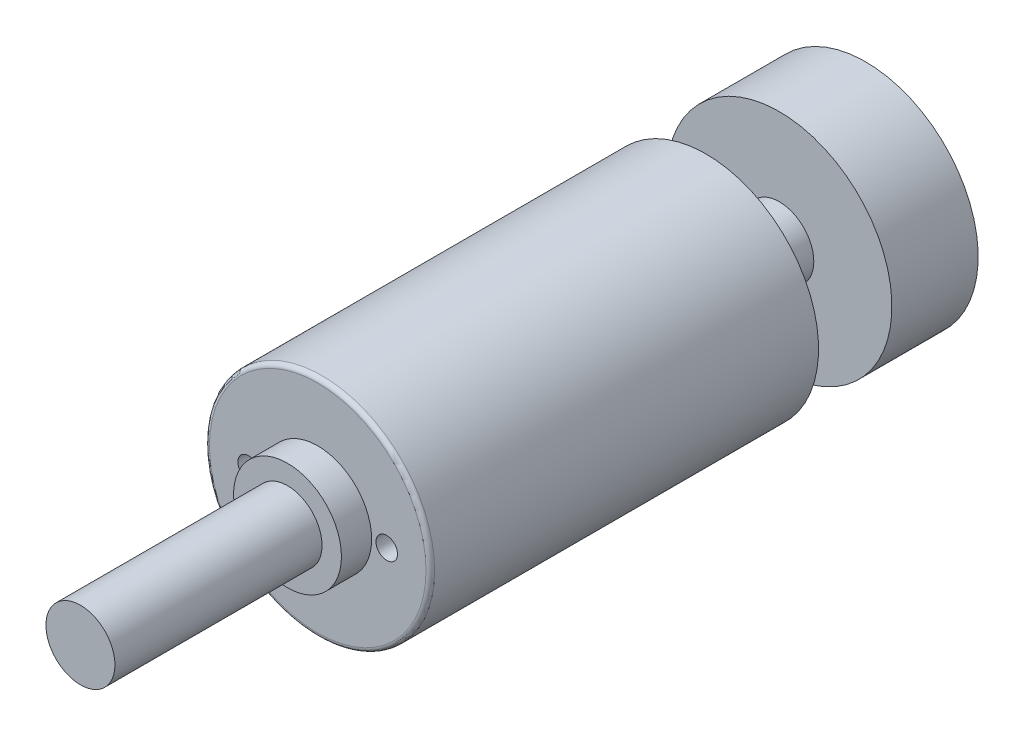
ISO-10303-21;
HEADER;
FILE_DESCRIPTION(('STEP AP214'),'2;1');
FILE_NAME('part.step','',(''),(''),'','','');
FILE_SCHEMA(('AUTOMOTIVE_DESIGN { 1 0 10303 214 1 1 1 1 }'));
ENDSEC;
DATA;
#1=APPLICATION_CONTEXT('core data for automotive mechanical design processes');
#2=APPLICATION_PROTOCOL_DEFINITION('international standard','automotive_design',2000,#1);
#3=PRODUCT_CONTEXT('',#1,'mechanical');
#4=PRODUCT('Part','Part','',(#3));
#5=PRODUCT_RELATED_PRODUCT_CATEGORY('part','',(#4));
#6=PRODUCT_DEFINITION_FORMATION('','',#4);
#7=PRODUCT_DEFINITION_CONTEXT('part definition',#1,'design');
#8=PRODUCT_DEFINITION('design','',#6,#7);
#9=PRODUCT_DEFINITION_SHAPE('','',#8);
#10=(LENGTH_UNIT() NAMED_UNIT(*) SI_UNIT(.MILLI.,.METRE.));
#11=(NAMED_UNIT(*) PLANE_ANGLE_UNIT() SI_UNIT($,.RADIAN.));
#12=(NAMED_UNIT(*) SI_UNIT($,.STERADIAN.) SOLID_ANGLE_UNIT());
#13=UNCERTAINTY_MEASURE_WITH_UNIT(LENGTH_MEASURE(1.E-05),#10,'distance_accuracy_value','');
#14=(GEOMETRIC_REPRESENTATION_CONTEXT(3) GLOBAL_UNCERTAINTY_ASSIGNED_CONTEXT((#13)) GLOBAL_UNIT_ASSIGNED_CONTEXT((#10,
#11,#12)) REPRESENTATION_CONTEXT('',''));
#15=CARTESIAN_POINT('',(0.,0.,0.));
#16=DIRECTION('',(0.,0.,1.));
#17=DIRECTION('',(1.,0.,0.));
#18=AXIS2_PLACEMENT_3D('',#15,#16,#17);
#19=CARTESIAN_POINT('',(0.,0.,0.));
#20=DIRECTION('',(0.,0.,1.));
#21=DIRECTION('',(1.,0.,0.));
#22=AXIS2_PLACEMENT_3D('',#19,#20,#21);
#23=PLANE('',#22);
#24=CARTESIAN_POINT('',(0.,0.,0.));
#25=DIRECTION('',(0.,0.,1.));
#26=DIRECTION('',(1.,0.,0.));
#27=AXIS2_PLACEMENT_3D('',#24,#25,#26);
#28=CIRCLE('',#27,26.1);
#29=CARTESIAN_POINT('',(-26.1,0.,0.));
#30=VERTEX_POINT('',#29);
#31=EDGE_CURVE('E46',#30,#30,#28,.T.);
#32=ORIENTED_EDGE('',*,*,#31,.F.);
#33=EDGE_LOOP('',(#32));
#34=FACE_BOUND('',#33,.T.);
#35=CARTESIAN_POINT('',(0.,0.,0.));
#36=DIRECTION('',(0.,0.,1.));
#37=DIRECTION('',(1.,0.,0.));
#38=AXIS2_PLACEMENT_3D('',#35,#36,#37);
#39=CIRCLE('',#38,8.);
#40=CARTESIAN_POINT('',(8.,0.,0.));
#41=VERTEX_POINT('',#40);
#42=EDGE_CURVE('E10',#41,#41,#39,.F.);
#43=ORIENTED_EDGE('',*,*,#42,.F.);
#44=EDGE_LOOP('',(#43));
#45=FACE_BOUND('',#44,.T.);
#46=ADVANCED_FACE('F31',(#34,#45),#23,.F.);
#47=CARTESIAN_POINT('',(0.,0.,97.));
#48=DIRECTION('',(0.,0.,1.));
#49=DIRECTION('',(1.,0.,0.));
#50=AXIS2_PLACEMENT_3D('',#47,#48,#49);
#51=PLANE('',#50);
#52=CARTESIAN_POINT('',(0.,0.,97.));
#53=DIRECTION('',(0.,0.,1.));
#54=DIRECTION('',(1.,0.,0.));
#55=AXIS2_PLACEMENT_3D('',#52,#53,#54);
#56=CIRCLE('',#55,12.5);
#57=CARTESIAN_POINT('',(12.5,0.,97.));
#58=VERTEX_POINT('',#57);
#59=EDGE_CURVE('E51',#58,#58,#56,.T.);
#60=ORIENTED_EDGE('',*,*,#59,.T.);
#61=EDGE_LOOP('',(#60));
#62=FACE_BOUND('',#61,.T.);
#63=CARTESIAN_POINT('',(0.,0.,97.));
#64=DIRECTION('',(0.,0.,1.));
#65=DIRECTION('',(1.,0.,0.));
#66=AXIS2_PLACEMENT_3D('',#63,#64,#65);
#67=CIRCLE('',#66,8.);
#68=CARTESIAN_POINT('',(8.,0.,97.));
#69=VERTEX_POINT('',#68);
#70=EDGE_CURVE('E58',#69,#69,#67,.T.);
#71=ORIENTED_EDGE('',*,*,#70,.F.);
#72=EDGE_LOOP('',(#71));
#73=FACE_BOUND('',#72,.T.);
#74=ADVANCED_FACE('F110',(#62,#73),#51,.T.);
#75=CARTESIAN_POINT('',(0.,0.,90.));
#76=DIRECTION('',(0.,0.,1.));
#77=DIRECTION('',(1.,0.,0.));
#78=AXIS2_PLACEMENT_3D('',#75,#76,#77);
#79=PLANE('',#78);
#80=CARTESIAN_POINT('',(16.,0.,90.));
#81=DIRECTION('',(0.,0.,1.));
#82=DIRECTION('',(1.,0.,0.));
#83=AXIS2_PLACEMENT_3D('',#80,#81,#82);
#84=CIRCLE('',#83,2.5);
#85=CARTESIAN_POINT('',(18.5,0.,90.));
#86=VERTEX_POINT('',#85);
#87=EDGE_CURVE('E70',#86,#86,#84,.T.);
#88=ORIENTED_EDGE('',*,*,#87,.F.);
#89=EDGE_LOOP('',(#88));
#90=FACE_BOUND('',#89,.T.);
#91=CARTESIAN_POINT('',(-16.,0.,90.));
#92=DIRECTION('',(0.,0.,1.));
#93=DIRECTION('',(1.,0.,0.));
#94=AXIS2_PLACEMENT_3D('',#91,#92,#93);
#95=CIRCLE('',#94,2.5);
#96=CARTESIAN_POINT('',(-13.5,0.,90.));
#97=VERTEX_POINT('',#96);
#98=EDGE_CURVE('E64',#97,#97,#95,.T.);
#99=ORIENTED_EDGE('',*,*,#98,.F.);
#100=EDGE_LOOP('',(#99));
#101=FACE_BOUND('',#100,.T.);
#102=CARTESIAN_POINT('',(0.,0.,90.));
#103=DIRECTION('',(0.,0.,1.));
#104=DIRECTION('',(1.,0.,0.));
#105=AXIS2_PLACEMENT_3D('',#102,#103,#104);
#106=CIRCLE('',#105,25.1);
#107=CARTESIAN_POINT('',(25.1,0.,90.));
#108=VERTEX_POINT('',#107);
#109=EDGE_CURVE('E42',#108,#108,#106,.T.);
#110=ORIENTED_EDGE('',*,*,#109,.T.);
#111=EDGE_LOOP('',(#110));
#112=FACE_BOUND('',#111,.T.);
#113=CARTESIAN_POINT('',(0.,0.,90.));
#114=DIRECTION('',(0.,0.,1.));
#115=DIRECTION('',(1.,0.,0.));
#116=AXIS2_PLACEMENT_3D('',#113,#114,#115);
#117=CIRCLE('',#116,12.5);
#118=CARTESIAN_POINT('',(12.5,0.,90.));
#119=VERTEX_POINT('',#118);
#120=EDGE_CURVE('E52',#119,#119,#117,.T.);
#121=ORIENTED_EDGE('',*,*,#120,.F.);
#122=EDGE_LOOP('',(#121));
#123=FACE_BOUND('',#122,.T.);
#124=ADVANCED_FACE('F116',(#90,#101,#112,#123),#79,.T.);
#125=CARTESIAN_POINT('',(0.,0.,90.));
#126=DIRECTION('',(0.,0.,-1.));
#127=DIRECTION('',(-1.,0.,0.));
#128=AXIS2_PLACEMENT_3D('',#125,#126,#127);
#129=CYLINDRICAL_SURFACE('',#128,26.1);
#130=CARTESIAN_POINT('',(0.,0.,89.));
#131=DIRECTION('',(0.,0.,1.));
#132=DIRECTION('',(1.,0.,0.));
#133=AXIS2_PLACEMENT_3D('',#130,#131,#132);
#134=CIRCLE('',#133,26.1);
#135=CARTESIAN_POINT('',(-26.1,0.,89.));
#136=VERTEX_POINT('',#135);
#137=EDGE_CURVE('E38',#136,#136,#134,.F.);
#138=CARTESIAN_POINT('',(-26.1,0.,89.));
#139=CARTESIAN_POINT('',(-26.1,0.,88.0729166666667));
#140=CARTESIAN_POINT('',(-26.1,0.,87.1458333333333));
#141=CARTESIAN_POINT('',(-26.1,0.,85.2916666666667));
#142=CARTESIAN_POINT('',(-26.1,0.,84.3645833333333));
#143=CARTESIAN_POINT('',(-26.1,0.,82.5104166666667));
#144=CARTESIAN_POINT('',(-26.1,0.,81.5833333333333));
#145=CARTESIAN_POINT('',(-26.1,0.,79.7291666666667));
#146=CARTESIAN_POINT('',(-26.1,0.,78.8020833333333));
#147=CARTESIAN_POINT('',(-26.1,0.,76.9479166666667));
#148=CARTESIAN_POINT('',(-26.1,0.,76.0208333333333));
#149=CARTESIAN_POINT('',(-26.1,0.,74.1666666666667));
#150=CARTESIAN_POINT('',(-26.1,0.,73.2395833333333));
#151=CARTESIAN_POINT('',(-26.1,0.,71.3854166666667));
#152=CARTESIAN_POINT('',(-26.1,0.,70.4583333333333));
#153=CARTESIAN_POINT('',(-26.1,0.,68.6041666666667));
#154=CARTESIAN_POINT('',(-26.1,0.,67.6770833333333));
#155=CARTESIAN_POINT('',(-26.1,0.,65.8229166666667));
#156=CARTESIAN_POINT('',(-26.1,0.,64.8958333333333));
#157=CARTESIAN_POINT('',(-26.1,0.,63.0416666666667));
#158=CARTESIAN_POINT('',(-26.1,0.,62.1145833333333));
#159=CARTESIAN_POINT('',(-26.1,0.,60.2604166666667));
#160=CARTESIAN_POINT('',(-26.1,0.,59.3333333333333));
#161=CARTESIAN_POINT('',(-26.1,0.,57.4791666666667));
#162=CARTESIAN_POINT('',(-26.1,0.,56.5520833333333));
#163=CARTESIAN_POINT('',(-26.1,0.,54.6979166666667));
#164=CARTESIAN_POINT('',(-26.1,0.,53.7708333333333));
#165=CARTESIAN_POINT('',(-26.1,0.,51.9166666666667));
#166=CARTESIAN_POINT('',(-26.1,0.,50.9895833333333));
#167=CARTESIAN_POINT('',(-26.1,0.,49.1354166666667));
#168=CARTESIAN_POINT('',(-26.1,0.,48.2083333333333));
#169=CARTESIAN_POINT('',(-26.1,0.,46.3541666666667));
#170=CARTESIAN_POINT('',(-26.1,0.,45.4270833333333));
#171=CARTESIAN_POINT('',(-26.1,0.,43.5729166666667));
#172=CARTESIAN_POINT('',(-26.1,0.,42.6458333333333));
#173=CARTESIAN_POINT('',(-26.1,0.,40.7916666666667));
#174=CARTESIAN_POINT('',(-26.1,0.,39.8645833333333));
#175=CARTESIAN_POINT('',(-26.1,0.,38.0104166666667));
#176=CARTESIAN_POINT('',(-26.1,0.,37.0833333333333));
#177=CARTESIAN_POINT('',(-26.1,0.,35.2291666666667));
#178=CARTESIAN_POINT('',(-26.1,0.,34.3020833333333));
#179=CARTESIAN_POINT('',(-26.1,0.,32.4479166666667));
#180=CARTESIAN_POINT('',(-26.1,0.,31.5208333333333));
#181=CARTESIAN_POINT('',(-26.1,0.,29.6666666666667));
#182=CARTESIAN_POINT('',(-26.1,0.,28.7395833333333));
#183=CARTESIAN_POINT('',(-26.1,0.,26.8854166666667));
#184=CARTESIAN_POINT('',(-26.1,0.,25.9583333333333));
#185=CARTESIAN_POINT('',(-26.1,0.,24.1041666666667));
#186=CARTESIAN_POINT('',(-26.1,0.,23.1770833333333));
#187=CARTESIAN_POINT('',(-26.1,0.,21.3229166666667));
#188=CARTESIAN_POINT('',(-26.1,0.,20.3958333333333));
#189=CARTESIAN_POINT('',(-26.1,0.,18.5416666666667));
#190=CARTESIAN_POINT('',(-26.1,0.,17.6145833333333));
#191=CARTESIAN_POINT('',(-26.1,0.,15.7604166666667));
#192=CARTESIAN_POINT('',(-26.1,0.,14.8333333333333));
#193=CARTESIAN_POINT('',(-26.1,0.,12.9791666666666));
#194=CARTESIAN_POINT('',(-26.1,0.,12.0520833333333));
#195=CARTESIAN_POINT('',(-26.1,0.,10.1979166666666));
#196=CARTESIAN_POINT('',(-26.1,0.,9.27083333333332));
#197=CARTESIAN_POINT('',(-26.1,0.,7.41666666666665));
#198=CARTESIAN_POINT('',(-26.1,0.,6.48958333333332));
#199=CARTESIAN_POINT('',(-26.1,0.,4.63541666666665));
#200=CARTESIAN_POINT('',(-26.1,0.,3.70833333333332));
#201=CARTESIAN_POINT('',(-26.1,0.,1.85416666666665));
#202=CARTESIAN_POINT('',(-26.1,0.,0.92708333333332));
#203=CARTESIAN_POINT('',(-26.1,0.,0.));
#204=B_SPLINE_CURVE_WITH_KNOTS('',3,(#138,#139,#140,#141,#142,#143,#144,#145,#146,#147,#148,
#149,#150,#151,#152,#153,#154,#155,#156,#157,#158,#159,#160,#161,#162,#163,#164,#165,#166,#167,
#168,#169,#170,#171,#172,#173,#174,#175,#176,#177,#178,#179,#180,#181,#182,#183,#184,#185,#186,
#187,#188,#189,#190,#191,#192,#193,#194,#195,#196,#197,#198,#199,#200,#201,#202,#203),
.UNSPECIFIED.,.F.,.F.,(4,2,2,2,2,2,2,2,2,2,2,2,2,2,2,2,2,2,2,2,2,2,2,2,2,2,2,2,2,2,2,2,4),(0.,
2.78125,5.5625,8.34375,11.125,13.90625,16.6875,19.46875,22.25,25.03125,27.8125,30.59375,33.375,
36.15625,38.9375,41.71875,44.5,47.28125,50.0625,52.84375,55.625,58.40625,61.1875,63.96875,66.75,
69.53125,72.3125,75.09375,77.875,80.65625,83.4375,86.21875,89.),.UNSPECIFIED.);
#205=EDGE_CURVE('BSEAM123',#136,#30,#204,.T.);
#206=ORIENTED_EDGE('',*,*,#137,.T.);
#207=ORIENTED_EDGE('',*,*,#31,.T.);
#208=ORIENTED_EDGE('',*,*,#205,.T.);
#209=ORIENTED_EDGE('',*,*,#205,.F.);
#210=EDGE_LOOP('',(#206,#208,#207,#209));
#211=FACE_BOUND('',#210,.T.);
#212=ADVANCED_FACE('F123',(#211),#129,.T.);
#213=CARTESIAN_POINT('',(0.,0.,89.));
#214=DIRECTION('',(0.,0.,1.));
#215=DIRECTION('',(1.,0.,0.));
#216=AXIS2_PLACEMENT_3D('',#213,#214,#215);
#217=TOROIDAL_SURFACE('',#216,25.1,1.);
#218=ORIENTED_EDGE('',*,*,#137,.F.);
#219=EDGE_LOOP('',(#218));
#220=FACE_BOUND('',#219,.T.);
#221=ORIENTED_EDGE('',*,*,#109,.F.);
#222=EDGE_LOOP('',(#221));
#223=FACE_BOUND('',#222,.T.);
#224=ADVANCED_FACE('F33',(#220,#223),#217,.T.);
#225=CARTESIAN_POINT('',(0.,0.,97.));
#226=DIRECTION('',(0.,0.,-1.));
#227=DIRECTION('',(-1.,0.,0.));
#228=AXIS2_PLACEMENT_3D('',#225,#226,#227);
#229=CYLINDRICAL_SURFACE('',#228,12.5);
#230=ORIENTED_EDGE('',*,*,#59,.F.);
#231=EDGE_LOOP('',(#230));
#232=FACE_BOUND('',#231,.T.);
#233=ORIENTED_EDGE('',*,*,#120,.T.);
#234=EDGE_LOOP('',(#233));
#235=FACE_BOUND('',#234,.T.);
#236=ADVANCED_FACE('F129',(#232,#235),#229,.T.);
#237=CARTESIAN_POINT('',(0.,0.,145.));
#238=DIRECTION('',(0.,0.,-1.));
#239=DIRECTION('',(-1.,0.,0.));
#240=AXIS2_PLACEMENT_3D('',#237,#238,#239);
#241=CYLINDRICAL_SURFACE('',#240,8.);
#242=CARTESIAN_POINT('',(0.,0.,145.));
#243=DIRECTION('',(0.,0.,1.));
#244=DIRECTION('',(1.,0.,0.));
#245=AXIS2_PLACEMENT_3D('',#242,#243,#244);
#246=CIRCLE('',#245,8.);
#247=CARTESIAN_POINT('',(8.,0.,145.));
#248=VERTEX_POINT('',#247);
#249=EDGE_CURVE('E55',#248,#248,#246,.T.);
#250=ORIENTED_EDGE('',*,*,#249,.F.);
#251=EDGE_LOOP('',(#250));
#252=FACE_BOUND('',#251,.T.);
#253=ORIENTED_EDGE('',*,*,#70,.T.);
#254=EDGE_LOOP('',(#253));
#255=FACE_BOUND('',#254,.T.);
#256=ADVANCED_FACE('F144',(#252,#255),#241,.T.);
#257=CARTESIAN_POINT('',(0.,0.,145.));
#258=DIRECTION('',(0.,0.,1.));
#259=DIRECTION('',(1.,0.,0.));
#260=AXIS2_PLACEMENT_3D('',#257,#258,#259);
#261=PLANE('',#260);
#262=ORIENTED_EDGE('',*,*,#249,.T.);
#263=EDGE_LOOP('',(#262));
#264=FACE_BOUND('',#263,.T.);
#265=ADVANCED_FACE('F149',(#264),#261,.T.);
#266=CARTESIAN_POINT('',(-16.,0.,85.));
#267=DIRECTION('',(0.,0.,1.));
#268=DIRECTION('',(1.,0.,0.));
#269=AXIS2_PLACEMENT_3D('',#266,#267,#268);
#270=CYLINDRICAL_SURFACE('',#269,2.5);
#271=CARTESIAN_POINT('',(-16.,0.,85.));
#272=DIRECTION('',(0.,0.,1.));
#273=DIRECTION('',(1.,0.,0.));
#274=AXIS2_PLACEMENT_3D('',#271,#272,#273);
#275=CIRCLE('',#274,2.5);
#276=CARTESIAN_POINT('',(-13.5,0.,85.));
#277=VERTEX_POINT('',#276);
#278=EDGE_CURVE('E61',#277,#277,#275,.T.);
#279=ORIENTED_EDGE('',*,*,#278,.F.);
#280=EDGE_LOOP('',(#279));
#281=FACE_BOUND('',#280,.T.);
#282=ORIENTED_EDGE('',*,*,#98,.T.);
#283=EDGE_LOOP('',(#282));
#284=FACE_BOUND('',#283,.T.);
#285=ADVANCED_FACE('F156',(#281,#284),#270,.F.);
#286=CARTESIAN_POINT('',(-16.,0.,85.));
#287=DIRECTION('',(0.,0.,1.));
#288=DIRECTION('',(1.,0.,0.));
#289=AXIS2_PLACEMENT_3D('',#286,#287,#288);
#290=PLANE('',#289);
#291=ORIENTED_EDGE('',*,*,#278,.T.);
#292=EDGE_LOOP('',(#291));
#293=FACE_BOUND('',#292,.T.);
#294=ADVANCED_FACE('F160',(#293),#290,.T.);
#295=CARTESIAN_POINT('',(16.,0.,85.));
#296=DIRECTION('',(0.,0.,1.));
#297=DIRECTION('',(1.,0.,0.));
#298=AXIS2_PLACEMENT_3D('',#295,#296,#297);
#299=CYLINDRICAL_SURFACE('',#298,2.5);
#300=CARTESIAN_POINT('',(16.,0.,85.));
#301=DIRECTION('',(0.,0.,1.));
#302=DIRECTION('',(1.,0.,0.));
#303=AXIS2_PLACEMENT_3D('',#300,#301,#302);
#304=CIRCLE('',#303,2.5);
#305=CARTESIAN_POINT('',(18.5,0.,85.));
#306=VERTEX_POINT('',#305);
#307=EDGE_CURVE('E67',#306,#306,#304,.T.);
#308=ORIENTED_EDGE('',*,*,#307,.F.);
#309=EDGE_LOOP('',(#308));
#310=FACE_BOUND('',#309,.T.);
#311=ORIENTED_EDGE('',*,*,#87,.T.);
#312=EDGE_LOOP('',(#311));
#313=FACE_BOUND('',#312,.T.);
#314=ADVANCED_FACE('F106',(#310,#313),#299,.F.);
#315=CARTESIAN_POINT('',(16.,0.,85.));
#316=DIRECTION('',(0.,0.,1.));
#317=DIRECTION('',(1.,0.,0.));
#318=AXIS2_PLACEMENT_3D('',#315,#316,#317);
#319=PLANE('',#318);
#320=ORIENTED_EDGE('',*,*,#307,.T.);
#321=EDGE_LOOP('',(#320));
#322=FACE_BOUND('',#321,.T.);
#323=ADVANCED_FACE('F101',(#322),#319,.T.);
#324=CARTESIAN_POINT('',(0.,0.,-17.));
#325=DIRECTION('',(0.,0.,1.));
#326=DIRECTION('',(1.,0.,0.));
#327=AXIS2_PLACEMENT_3D('',#324,#325,#326);
#328=CYLINDRICAL_SURFACE('',#327,8.);
#329=CARTESIAN_POINT('',(0.,0.,-17.));
#330=DIRECTION('',(0.,0.,-1.));
#331=DIRECTION('',(-1.,0.,0.));
#332=AXIS2_PLACEMENT_3D('',#329,#330,#331);
#333=CIRCLE('',#332,8.);
#334=CARTESIAN_POINT('',(-8.,0.,-17.));
#335=VERTEX_POINT('',#334);
#336=EDGE_CURVE('E73',#335,#335,#333,.T.);
#337=ORIENTED_EDGE('',*,*,#336,.F.);
#338=EDGE_LOOP('',(#337));
#339=FACE_BOUND('',#338,.T.);
#340=ORIENTED_EDGE('',*,*,#42,.T.);
#341=EDGE_LOOP('',(#340));
#342=FACE_BOUND('',#341,.T.);
#343=ADVANCED_FACE('F96',(#339,#342),#328,.T.);
#344=CARTESIAN_POINT('',(0.,0.,-17.));
#345=DIRECTION('',(0.,0.,-1.));
#346=DIRECTION('',(-1.,0.,0.));
#347=AXIS2_PLACEMENT_3D('',#344,#345,#346);
#348=PLANE('',#347);
#349=CARTESIAN_POINT('',(0.,0.,-17.));
#350=DIRECTION('',(0.,0.,-1.));
#351=DIRECTION('',(-1.,0.,0.));
#352=AXIS2_PLACEMENT_3D('',#349,#350,#351);
#353=CIRCLE('',#352,26.1);
#354=CARTESIAN_POINT('',(-26.1,0.,-17.));
#355=VERTEX_POINT('',#354);
#356=EDGE_CURVE('E79',#355,#355,#353,.T.);
#357=ORIENTED_EDGE('',*,*,#356,.F.);
#358=EDGE_LOOP('',(#357));
#359=FACE_BOUND('',#358,.T.);
#360=ORIENTED_EDGE('',*,*,#336,.T.);
#361=EDGE_LOOP('',(#360));
#362=FACE_BOUND('',#361,.T.);
#363=ADVANCED_FACE('F90',(#359,#362),#348,.F.);
#364=CARTESIAN_POINT('',(0.,0.,-37.));
#365=DIRECTION('',(0.,0.,1.));
#366=DIRECTION('',(1.,0.,0.));
#367=AXIS2_PLACEMENT_3D('',#364,#365,#366);
#368=CYLINDRICAL_SURFACE('',#367,26.1);
#369=CARTESIAN_POINT('',(0.,0.,-37.));
#370=DIRECTION('',(0.,0.,-1.));
#371=DIRECTION('',(-1.,0.,0.));
#372=AXIS2_PLACEMENT_3D('',#369,#370,#371);
#373=CIRCLE('',#372,26.1);
#374=CARTESIAN_POINT('',(-26.1,0.,-37.));
#375=VERTEX_POINT('',#374);
#376=EDGE_CURVE('E78',#375,#375,#373,.T.);
#377=ORIENTED_EDGE('',*,*,#376,.F.);
#378=EDGE_LOOP('',(#377));
#379=FACE_BOUND('',#378,.T.);
#380=ORIENTED_EDGE('',*,*,#356,.T.);
#381=EDGE_LOOP('',(#380));
#382=FACE_BOUND('',#381,.T.);
#383=ADVANCED_FACE('F87',(#379,#382),#368,.T.);
#384=CARTESIAN_POINT('',(0.,0.,-37.));
#385=DIRECTION('',(0.,0.,-1.));
#386=DIRECTION('',(-1.,0.,0.));
#387=AXIS2_PLACEMENT_3D('',#384,#385,#386);
#388=PLANE('',#387);
#389=ORIENTED_EDGE('',*,*,#376,.T.);
#390=EDGE_LOOP('',(#389));
#391=FACE_BOUND('',#390,.T.);
#392=ADVANCED_FACE('F85',(#391),#388,.T.);
#393=CLOSED_SHELL('',(#46,#74,#124,#212,#224,#236,#256,#265,#285,#294,#314,#323,#343,#363,#383,#392));
#394=MANIFOLD_SOLID_BREP('B2',#393);
#395=ADVANCED_BREP_SHAPE_REPRESENTATION('',(#18,#394),#14);
#396=SHAPE_DEFINITION_REPRESENTATION(#9,#395);
ENDSEC;
END-ISO-10303-21;
